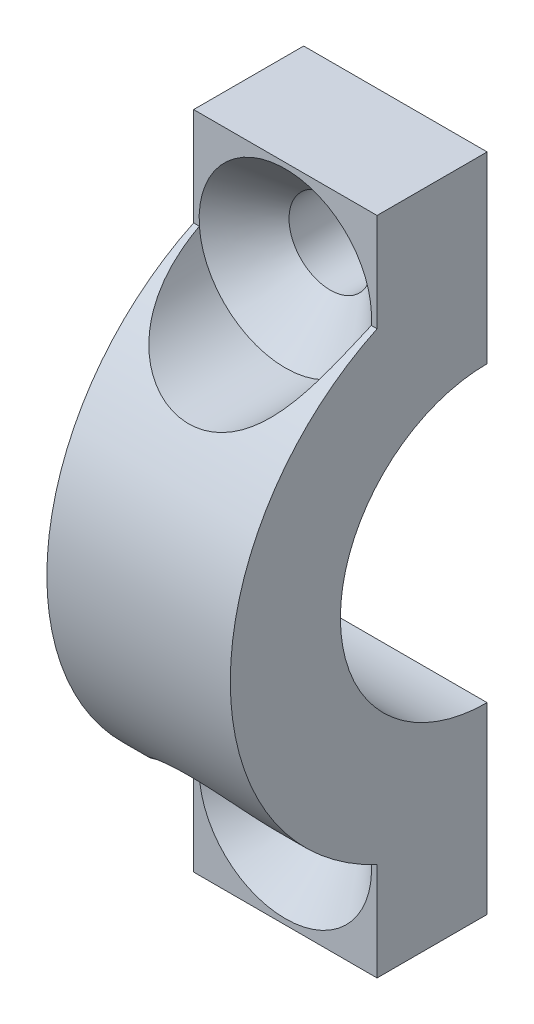
ISO-10303-21;
HEADER;
FILE_DESCRIPTION(('STEP AP214'),'2;1');
FILE_NAME('part.step','',(''),(''),'','','');
FILE_SCHEMA(('AUTOMOTIVE_DESIGN { 1 0 10303 214 1 1 1 1 }'));
ENDSEC;
DATA;
#1=APPLICATION_CONTEXT('core data for automotive mechanical design processes');
#2=APPLICATION_PROTOCOL_DEFINITION('international standard','automotive_design',2000,#1);
#3=PRODUCT_CONTEXT('',#1,'mechanical');
#4=PRODUCT('Part','Part','',(#3));
#5=PRODUCT_RELATED_PRODUCT_CATEGORY('part','',(#4));
#6=PRODUCT_DEFINITION_FORMATION('','',#4);
#7=PRODUCT_DEFINITION_CONTEXT('part definition',#1,'design');
#8=PRODUCT_DEFINITION('design','',#6,#7);
#9=PRODUCT_DEFINITION_SHAPE('','',#8);
#10=(LENGTH_UNIT() NAMED_UNIT(*) SI_UNIT(.MILLI.,.METRE.));
#11=(NAMED_UNIT(*) PLANE_ANGLE_UNIT() SI_UNIT($,.RADIAN.));
#12=(NAMED_UNIT(*) SI_UNIT($,.STERADIAN.) SOLID_ANGLE_UNIT());
#13=UNCERTAINTY_MEASURE_WITH_UNIT(LENGTH_MEASURE(1.E-05),#10,'distance_accuracy_value','');
#14=(GEOMETRIC_REPRESENTATION_CONTEXT(3) GLOBAL_UNCERTAINTY_ASSIGNED_CONTEXT((#13)) GLOBAL_UNIT_ASSIGNED_CONTEXT((#10,
#11,#12)) REPRESENTATION_CONTEXT('',''));
#15=CARTESIAN_POINT('',(0.,0.,0.));
#16=DIRECTION('',(0.,0.,1.));
#17=DIRECTION('',(1.,0.,0.));
#18=AXIS2_PLACEMENT_3D('',#15,#16,#17);
#19=CARTESIAN_POINT('',(15.,72.,18.));
#20=DIRECTION('',(-1.,0.,0.));
#21=DIRECTION('',(0.,0.,1.));
#22=AXIS2_PLACEMENT_3D('',#19,#20,#21);
#23=CYLINDRICAL_SURFACE('',#22,14.);
#24=CARTESIAN_POINT('',(14.6868834695895,84.6491106406736,23.9999999999999));
#25=CARTESIAN_POINT('',(14.6823539005448,84.5886792170102,24.1274015593818));
#26=CARTESIAN_POINT('',(14.6765172939017,84.5263433670282,24.2538435760604));
#27=CARTESIAN_POINT('',(14.661729002425,84.3979447212664,24.5046776273374));
#28=CARTESIAN_POINT('',(14.652776464601,84.3318809091053,24.6290690908181));
#29=CARTESIAN_POINT('',(14.6204102459824,84.1277205338109,24.9998682997629));
#30=CARTESIAN_POINT('',(14.5915165208751,83.9841474572963,25.2428631080751));
#31=CARTESIAN_POINT('',(14.5141507266147,83.6820083526137,25.7208624991565));
#32=CARTESIAN_POINT('',(14.4654186962824,83.52326554239,25.9557142157521));
#33=CARTESIAN_POINT('',(14.3432423004083,83.1953488194853,26.4108542290577));
#34=CARTESIAN_POINT('',(14.2698493195431,83.026197188877,26.6311716773669));
#35=CARTESIAN_POINT('',(14.1352341599305,82.7639172614953,26.9531292789493));
#36=CARTESIAN_POINT('',(14.0849195081585,82.6730333481254,27.0612277914284));
#37=CARTESIAN_POINT('',(13.9753243715645,82.490390528231,27.2720613250417));
#38=CARTESIAN_POINT('',(13.9160436213424,82.398631595881,27.3747961872886));
#39=CARTESIAN_POINT('',(13.7880992759076,82.2156296041822,27.5738775230491));
#40=CARTESIAN_POINT('',(13.7194723520586,82.1243859125023,27.6702468804612));
#41=CARTESIAN_POINT('',(13.5721245740286,81.9432777628691,27.856372760744));
#42=CARTESIAN_POINT('',(13.4934038710877,81.853413284273,27.9461293826651));
#43=CARTESIAN_POINT('',(13.3244125180841,81.6753131072687,28.1194841919881));
#44=CARTESIAN_POINT('',(13.2340045102641,81.5871139841926,28.2029866926637));
#45=CARTESIAN_POINT('',(13.042363918755,81.4152293115991,28.361812097394));
#46=CARTESIAN_POINT('',(12.9411334949725,81.3315428664514,28.4371366275587));
#47=CARTESIAN_POINT('',(12.7280303213367,81.1704186151429,28.5789862626215));
#48=CARTESIAN_POINT('',(12.6161563334604,81.0929815378281,28.6455103417247));
#49=CARTESIAN_POINT('',(12.3823626498263,80.9461888583714,28.7691652669169));
#50=CARTESIAN_POINT('',(12.2604452216227,80.8768314405376,28.8262982246053));
#51=CARTESIAN_POINT('',(12.0260110698942,80.7573620276484,28.9230779758885));
#52=CARTESIAN_POINT('',(11.9147210392595,80.7059186391237,28.9640599156844));
#53=CARTESIAN_POINT('',(11.6863371380591,80.6112028055511,29.0386059428302));
#54=CARTESIAN_POINT('',(11.5692442990841,80.5679289147076,29.0721713429007));
#55=CARTESIAN_POINT('',(11.3303063416184,80.4904489681364,29.1316964283244));
#56=CARTESIAN_POINT('',(11.2084642633792,80.4562372171402,29.1576608917106));
#57=CARTESIAN_POINT('',(10.9610937145978,80.3975603916059,29.2018897783838));
#58=CARTESIAN_POINT('',(10.8355657010723,80.3730941141665,29.2201551519995));
#59=CARTESIAN_POINT('',(10.5996820754628,80.3371061993207,29.2469144913718));
#60=CARTESIAN_POINT('',(10.4896396149932,80.3242589717311,29.2564130120863));
#61=CARTESIAN_POINT('',(10.2685802436299,80.3063705773454,29.2696199454961));
#62=CARTESIAN_POINT('',(10.1575634168155,80.301328743544,29.2733288529397));
#63=CARTESIAN_POINT('',(9.93545340716804,80.2991314873372,29.2749464718671));
#64=CARTESIAN_POINT('',(9.8243602695446,80.3019730608091,29.2728573927842));
#65=CARTESIAN_POINT('',(9.60291205565764,80.3154908742178,29.2628895965998));
#66=CARTESIAN_POINT('',(9.49255697957448,80.3261671160691,29.2550108780836));
#67=CARTESIAN_POINT('',(9.2778382619672,80.3546005272574,29.2339195444487));
#68=CARTESIAN_POINT('',(9.17341207330098,80.3720558719215,29.2209340227804));
#69=CARTESIAN_POINT('',(8.96669893434886,80.4137804146887,29.1896817688636));
#70=CARTESIAN_POINT('',(8.86441269370686,80.4380518358098,29.1714133135634));
#71=CARTESIAN_POINT('',(8.66273041101343,80.4930464237721,29.1296609145117));
#72=CARTESIAN_POINT('',(8.56333315997075,80.5237668462406,29.1061791890233));
#73=CARTESIAN_POINT('',(8.36796008250096,80.5912436298838,29.0540648620609));
#74=CARTESIAN_POINT('',(8.27198555096368,80.6280022465654,29.0254303354267));
#75=CARTESIAN_POINT('',(8.08178401922044,80.7079912105161,28.9623692841561));
#76=CARTESIAN_POINT('',(7.98765369636385,80.7513553020197,28.9278206244581));
#77=CARTESIAN_POINT('',(7.80405759359493,80.8432710509733,28.8535733507942));
#78=CARTESIAN_POINT('',(7.71459350994676,80.8918245755892,28.8138728820922));
#79=CARTESIAN_POINT('',(7.45385775328449,81.0442947980985,28.6872882556059));
#80=CARTESIAN_POINT('',(7.29012108935183,81.155073344968,28.5928805935764));
#81=CARTESIAN_POINT('',(6.97131429987674,81.3998484040593,28.376503455337));
#82=CARTESIAN_POINT('',(6.81834793116282,81.5350370116572,28.2528188108821));
#83=CARTESIAN_POINT('',(6.53924095630963,81.8137695156495,27.9863433746235));
#84=CARTESIAN_POINT('',(6.41309970388549,81.9573132106427,27.8435530432591));
#85=CARTESIAN_POINT('',(6.21306711267954,82.2127249239649,27.5773620783008));
#86=CARTESIAN_POINT('',(6.13387251047209,82.3240629772442,27.4573524476103));
#87=CARTESIAN_POINT('',(5.9891510858168,82.5462934932211,27.2088796515745));
#88=CARTESIAN_POINT('',(5.92363058605982,82.6571857266397,27.0804126116099));
#89=CARTESIAN_POINT('',(5.80476123159012,82.8773357422786,26.8155194942524));
#90=CARTESIAN_POINT('',(5.75147225359986,82.9865831361432,26.6790582031898));
#91=CARTESIAN_POINT('',(5.65606733654586,83.2016424595153,26.399660862454));
#92=CARTESIAN_POINT('',(5.61395415960595,83.3074535340684,26.2567232223374));
#93=CARTESIAN_POINT('',(5.53457530625007,83.528421768105,25.9458494753461));
#94=CARTESIAN_POINT('',(5.4986978608515,83.6429519353129,25.7771158396482));
#95=CARTESIAN_POINT('',(5.43755828991146,83.8653523691441,25.4333946302858));
#96=CARTESIAN_POINT('',(5.41230046014622,83.97321992563,25.2584045568052));
#97=CARTESIAN_POINT('',(5.3708513662753,84.1802397936259,24.9052951950059));
#98=CARTESIAN_POINT('',(5.35455092491359,84.2794840427283,24.7272421789051));
#99=CARTESIAN_POINT('',(5.32897419165093,84.4701976287886,24.366773895951));
#100=CARTESIAN_POINT('',(5.31969005694165,84.5616755450577,24.1843637355848));
#101=CARTESIAN_POINT('',(5.31311653041046,84.6491106406735,24.));
#102=B_SPLINE_CURVE_WITH_KNOTS('',3,(#24,#25,#26,#27,#28,#29,#30,#31,#32,#33,#34,#35,#36,#37,
#38,#39,#40,#41,#42,#43,#44,#45,#46,#47,#48,#49,#50,#51,#52,#53,#54,#55,#56,#57,#58,#59,#60,#61,
#62,#63,#64,#65,#66,#67,#68,#69,#70,#71,#72,#73,#74,#75,#76,#77,#78,#79,#80,#81,#82,#83,#84,#85,
#86,#87,#88,#89,#90,#91,#92,#93,#94,#95,#96,#97,#98,#99,#100,#101),.UNSPECIFIED.,.F.,.F.,(4,2,2,
2,2,2,2,2,2,2,2,2,2,2,2,2,2,2,2,2,2,2,2,2,2,2,2,2,2,2,2,2,2,2,2,2,2,2,4),(0.,0.423195212600214,
0.8465063667184,1.69656664790296,2.5581443222514,3.4179377931578,3.86740222850983,
4.31687997078842,4.76464236023668,5.21239804141275,5.66599869222872,6.11950898313544,
6.5730720894482,7.02653307189912,7.41378176108311,7.80096185261463,8.18789803323816,
8.57478643881981,8.90796041087282,9.24110591017275,9.57412447547004,9.90714312214675,
10.2267778523521,10.546516950611,10.8661202587244,11.1858432240683,11.5132120962637,
11.8406991553313,12.4952631566787,13.2086950237119,13.9221097004195,14.4669488469189,
15.012039363071,15.5597438963729,16.1075836702499,16.7282374289768,17.3491420094452,
17.962300612815,18.5747728112748),.UNSPECIFIED.);
#103=CARTESIAN_POINT('',(14.6868834695896,84.6491106406735,24.));
#104=VERTEX_POINT('',#103);
#105=CARTESIAN_POINT('',(5.31311653041048,84.6491106406736,23.9999999999999));
#106=VERTEX_POINT('',#105);
#107=EDGE_CURVE('E47',#104,#106,#102,.T.);
#108=ORIENTED_EDGE('',*,*,#107,.T.);
#109=DIRECTION('',(-1.,0.,0.));
#110=VECTOR('',#109,1.);
#111=CARTESIAN_POINT('',(15.,84.6491106406735,24.));
#112=LINE('',#111,#110);
#113=CARTESIAN_POINT('',(5.,84.6491106406735,24.));
#114=VERTEX_POINT('',#113);
#115=EDGE_CURVE('E119',#106,#114,#112,.T.);
#116=ORIENTED_EDGE('',*,*,#115,.T.);
#117=CARTESIAN_POINT('',(5.,72.,18.));
#118=DIRECTION('',(1.,0.,0.));
#119=DIRECTION('',(0.,0.,-1.));
#120=AXIS2_PLACEMENT_3D('',#117,#118,#119);
#121=CIRCLE('',#120,14.);
#122=CARTESIAN_POINT('',(5.,59.3508893593265,24.));
#123=VERTEX_POINT('',#122);
#124=EDGE_CURVE('E170',#114,#123,#121,.T.);
#125=ORIENTED_EDGE('',*,*,#124,.T.);
#126=DIRECTION('',(-1.,0.,0.));
#127=VECTOR('',#126,1.);
#128=CARTESIAN_POINT('',(15.,59.3508893593265,24.));
#129=LINE('',#128,#127);
#130=CARTESIAN_POINT('',(5.31311653041043,59.3508893593265,24.));
#131=VERTEX_POINT('',#130);
#132=EDGE_CURVE('E41',#131,#123,#129,.T.);
#133=ORIENTED_EDGE('',*,*,#132,.F.);
#134=CARTESIAN_POINT('',(5.31311653041046,59.3508893593264,23.9999999999999));
#135=CARTESIAN_POINT('',(5.31764609945523,59.4113207829898,24.1274015593818));
#136=CARTESIAN_POINT('',(5.32348270609832,59.4736566329718,24.2538435760604));
#137=CARTESIAN_POINT('',(5.33827099757497,59.6020552787336,24.5046776273374));
#138=CARTESIAN_POINT('',(5.34722353539904,59.6681190908947,24.6290690908181));
#139=CARTESIAN_POINT('',(5.37958975401756,59.8722794661892,24.9998682997629));
#140=CARTESIAN_POINT('',(5.40848347912487,60.0158525427037,25.2428631080751));
#141=CARTESIAN_POINT('',(5.48584927338526,60.3179916473863,25.7208624991565));
#142=CARTESIAN_POINT('',(5.5345813037176,60.47673445761,25.9557142157521));
#143=CARTESIAN_POINT('',(5.65675769959167,60.8046511805147,26.4108542290577));
#144=CARTESIAN_POINT('',(5.73015068045693,60.973802811123,26.6311716773669));
#145=CARTESIAN_POINT('',(5.86476584006947,61.2360827385047,26.9531292789493));
#146=CARTESIAN_POINT('',(5.91508049184144,61.3269666518746,27.0612277914284));
#147=CARTESIAN_POINT('',(6.0246756284355,61.509609471769,27.2720613250417));
#148=CARTESIAN_POINT('',(6.08395637865759,61.601368404119,27.3747961872886));
#149=CARTESIAN_POINT('',(6.21190072409242,61.7843703958178,27.5738775230491));
#150=CARTESIAN_POINT('',(6.28052764794135,61.8756140874977,27.6702468804612));
#151=CARTESIAN_POINT('',(6.42787542597143,62.0567222371309,27.856372760744));
#152=CARTESIAN_POINT('',(6.50659612891225,62.146586715727,27.9461293826651));
#153=CARTESIAN_POINT('',(6.67558748191585,62.3246868927313,28.1194841919881));
#154=CARTESIAN_POINT('',(6.76599548973591,62.4128860158074,28.2029866926637));
#155=CARTESIAN_POINT('',(6.95763608124504,62.5847706884009,28.361812097394));
#156=CARTESIAN_POINT('',(7.05886650502746,62.6684571335487,28.4371366275587));
#157=CARTESIAN_POINT('',(7.27196967866328,62.8295813848571,28.5789862626215));
#158=CARTESIAN_POINT('',(7.38384366653956,62.9070184621719,28.6455103417247));
#159=CARTESIAN_POINT('',(7.61763735017365,63.0538111416286,28.7691652669169));
#160=CARTESIAN_POINT('',(7.73955477837726,63.1231685594624,28.8262982246053));
#161=CARTESIAN_POINT('',(7.97398893010577,63.2426379723516,28.9230779758885));
#162=CARTESIAN_POINT('',(8.08527896074048,63.2940813608763,28.9640599156844));
#163=CARTESIAN_POINT('',(8.31366286194089,63.3887971944489,29.0386059428303));
#164=CARTESIAN_POINT('',(8.43075570091592,63.4320710852924,29.0721713429007));
#165=CARTESIAN_POINT('',(8.66969365838158,63.5095510318636,29.1316964283244));
#166=CARTESIAN_POINT('',(8.79153573662078,63.5437627828598,29.1576608917106));
#167=CARTESIAN_POINT('',(9.03890628540216,63.6024396083941,29.2018897783838));
#168=CARTESIAN_POINT('',(9.16443429892773,63.6269058858336,29.2201551519995));
#169=CARTESIAN_POINT('',(9.40031792453716,63.6628938006793,29.2469144913718));
#170=CARTESIAN_POINT('',(9.51036038500679,63.6757410282689,29.2564130120863));
#171=CARTESIAN_POINT('',(9.73141975637014,63.6936294226546,29.2696199454961));
#172=CARTESIAN_POINT('',(9.84243658318452,63.698671256456,29.2733288529397));
#173=CARTESIAN_POINT('',(10.064546592832,63.7008685126628,29.2749464718671));
#174=CARTESIAN_POINT('',(10.1756397304554,63.6980269391909,29.2728573927842));
#175=CARTESIAN_POINT('',(10.3970879443424,63.6845091257822,29.2628895965998));
#176=CARTESIAN_POINT('',(10.5074430204255,63.6738328839309,29.2550108780836));
#177=CARTESIAN_POINT('',(10.7221617380328,63.6453994727426,29.2339195444487));
#178=CARTESIAN_POINT('',(10.826587926699,63.6279441280785,29.2209340227804));
#179=CARTESIAN_POINT('',(11.0333010656511,63.5862195853113,29.1896817688636));
#180=CARTESIAN_POINT('',(11.1355873062931,63.5619481641902,29.1714133135634));
#181=CARTESIAN_POINT('',(11.3372695889866,63.506953576228,29.1296609145117));
#182=CARTESIAN_POINT('',(11.4366668400293,63.4762331537594,29.1061791890233));
#183=CARTESIAN_POINT('',(11.632039917499,63.4087563701162,29.0540648620609));
#184=CARTESIAN_POINT('',(11.7280144490363,63.3719977534346,29.0254303354267));
#185=CARTESIAN_POINT('',(11.9182159807796,63.2920087894839,28.9623692841561));
#186=CARTESIAN_POINT('',(12.0123463036362,63.2486446979803,28.9278206244581));
#187=CARTESIAN_POINT('',(12.1959424064051,63.1567289490267,28.8535733507942));
#188=CARTESIAN_POINT('',(12.2854064900532,63.1081754244108,28.8138728820922));
#189=CARTESIAN_POINT('',(12.5461422467155,62.9557052019015,28.6872882556059));
#190=CARTESIAN_POINT('',(12.7098789106482,62.844926655032,28.5928805935764));
#191=CARTESIAN_POINT('',(13.0286857001233,62.6001515959407,28.376503455337));
#192=CARTESIAN_POINT('',(13.1816520688372,62.4649629883428,28.2528188108821));
#193=CARTESIAN_POINT('',(13.4607590436904,62.1862304843505,27.9863433746235));
#194=CARTESIAN_POINT('',(13.5869002961145,62.0426867893573,27.8435530432591));
#195=CARTESIAN_POINT('',(13.7869328873205,61.7872750760351,27.5773620783008));
#196=CARTESIAN_POINT('',(13.8661274895279,61.6759370227558,27.4573524476103));
#197=CARTESIAN_POINT('',(14.0108489141832,61.4537065067789,27.2088796515745));
#198=CARTESIAN_POINT('',(14.0763694139402,61.3428142733603,27.0804126116099));
#199=CARTESIAN_POINT('',(14.1952387684099,61.1226642577215,26.8155194942524));
#200=CARTESIAN_POINT('',(14.2485277464001,61.0134168638568,26.6790582031898));
#201=CARTESIAN_POINT('',(14.3439326634541,60.7983575404848,26.399660862454));
#202=CARTESIAN_POINT('',(14.386045840394,60.6925464659317,26.2567232223373));
#203=CARTESIAN_POINT('',(14.4654246937499,60.471578231895,25.9458494753461));
#204=CARTESIAN_POINT('',(14.5013021391485,60.3570480646871,25.7771158396482));
#205=CARTESIAN_POINT('',(14.5624417100885,60.1346476308559,25.4333946302858));
#206=CARTESIAN_POINT('',(14.5876995398538,60.02678007437,25.2584045568052));
#207=CARTESIAN_POINT('',(14.6291486337247,59.8197602063741,24.9052951950059));
#208=CARTESIAN_POINT('',(14.6454490750864,59.7205159572717,24.7272421789051));
#209=CARTESIAN_POINT('',(14.6710258083491,59.5298023712114,24.366773895951));
#210=CARTESIAN_POINT('',(14.6803099430583,59.4383244549423,24.1843637355848));
#211=CARTESIAN_POINT('',(14.6868834695895,59.3508893593265,24.));
#212=B_SPLINE_CURVE_WITH_KNOTS('',3,(#134,#135,#136,#137,#138,#139,#140,#141,#142,#143,#144,
#145,#146,#147,#148,#149,#150,#151,#152,#153,#154,#155,#156,#157,#158,#159,#160,#161,#162,#163,
#164,#165,#166,#167,#168,#169,#170,#171,#172,#173,#174,#175,#176,#177,#178,#179,#180,#181,#182,
#183,#184,#185,#186,#187,#188,#189,#190,#191,#192,#193,#194,#195,#196,#197,#198,#199,#200,#201,
#202,#203,#204,#205,#206,#207,#208,#209,#210,#211),.UNSPECIFIED.,.F.,.F.,(4,2,2,2,2,2,2,2,2,2,2,
2,2,2,2,2,2,2,2,2,2,2,2,2,2,2,2,2,2,2,2,2,2,2,2,2,2,2,4),(0.,0.423195212600214,0.8465063667184,
1.69656664790294,2.55814432225137,3.41793779315778,3.86740222850982,4.31687997078841,
4.76464236023667,5.21239804141274,5.66599869222872,6.11950898313544,6.57307208944819,
7.02653307189912,7.41378176108312,7.80096185261464,8.18789803323816,8.57478643881981,
8.90796041087283,9.24110591017276,9.57412447547005,9.90714312214676,10.2267778523521,
10.546516950611,10.8661202587244,11.1858432240683,11.5132120962637,11.8406991553313,
12.4952631566787,13.2086950237119,13.9221097004195,14.4669488469189,15.012039363071,
15.5597438963729,16.1075836702499,16.7282374289769,17.3491420094452,17.962300612815,
18.5747728112748),.UNSPECIFIED.);
#213=CARTESIAN_POINT('',(14.6868834695895,59.3508893593265,23.9999999999999));
#214=VERTEX_POINT('',#213);
#215=EDGE_CURVE('E54',#131,#214,#212,.T.);
#216=ORIENTED_EDGE('',*,*,#215,.T.);
#217=CARTESIAN_POINT('',(15.,59.3508893593265,24.));
#218=VERTEX_POINT('',#217);
#219=EDGE_CURVE('E11',#218,#214,#129,.T.);
#220=ORIENTED_EDGE('',*,*,#219,.F.);
#221=CARTESIAN_POINT('',(15.,72.,18.));
#222=DIRECTION('',(1.,0.,0.));
#223=DIRECTION('',(0.,0.,-1.));
#224=AXIS2_PLACEMENT_3D('',#221,#222,#223);
#225=CIRCLE('',#224,14.);
#226=CARTESIAN_POINT('',(15.,84.6491106406735,24.));
#227=VERTEX_POINT('',#226);
#228=EDGE_CURVE('E189',#227,#218,#225,.T.);
#229=ORIENTED_EDGE('',*,*,#228,.F.);
#230=EDGE_CURVE('E123',#227,#104,#112,.T.);
#231=ORIENTED_EDGE('',*,*,#230,.T.);
#232=EDGE_LOOP('',(#108,#116,#125,#133,#216,#220,#229,#231));
#233=FACE_BOUND('',#232,.T.);
#234=ADVANCED_FACE('F34',(#233),#23,.T.);
#235=CARTESIAN_POINT('',(15.,90.,24.));
#236=DIRECTION('',(0.,0.,-1.));
#237=DIRECTION('',(0.,1.,0.));
#238=AXIS2_PLACEMENT_3D('',#235,#236,#237);
#239=PLANE('',#238);
#240=CARTESIAN_POINT('',(10.,85.,23.9999999999999));
#241=DIRECTION('',(0.,0.,1.));
#242=DIRECTION('',(0.,-1.,0.));
#243=AXIS2_PLACEMENT_3D('',#240,#241,#242);
#244=CIRCLE('',#243,4.7);
#245=EDGE_CURVE('E112',#104,#106,#244,.T.);
#246=ORIENTED_EDGE('',*,*,#245,.F.);
#247=ORIENTED_EDGE('',*,*,#230,.F.);
#248=DIRECTION('',(0.,-1.,0.));
#249=VECTOR('',#248,1.);
#250=CARTESIAN_POINT('',(15.,90.,24.));
#251=LINE('',#250,#249);
#252=CARTESIAN_POINT('',(15.,90.,24.));
#253=VERTEX_POINT('',#252);
#254=EDGE_CURVE('E134',#253,#227,#251,.T.);
#255=ORIENTED_EDGE('',*,*,#254,.F.);
#256=DIRECTION('',(-1.,0.,0.));
#257=VECTOR('',#256,1.);
#258=CARTESIAN_POINT('',(15.,90.,24.));
#259=LINE('',#258,#257);
#260=CARTESIAN_POINT('',(5.,90.,24.));
#261=VERTEX_POINT('',#260);
#262=EDGE_CURVE('E136',#253,#261,#259,.T.);
#263=ORIENTED_EDGE('',*,*,#262,.T.);
#264=DIRECTION('',(0.,-1.,0.));
#265=VECTOR('',#264,1.);
#266=CARTESIAN_POINT('',(5.,90.,24.));
#267=LINE('',#266,#265);
#268=EDGE_CURVE('E132',#261,#114,#267,.T.);
#269=ORIENTED_EDGE('',*,*,#268,.T.);
#270=ORIENTED_EDGE('',*,*,#115,.F.);
#271=EDGE_LOOP('',(#246,#247,#255,#263,#269,#270));
#272=FACE_BOUND('',#271,.T.);
#273=ADVANCED_FACE('F129',(#272),#239,.F.);
#274=CARTESIAN_POINT('',(15.,54.,24.));
#275=DIRECTION('',(0.,0.,-1.));
#276=DIRECTION('',(-1.,0.,0.));
#277=AXIS2_PLACEMENT_3D('',#274,#275,#276);
#278=PLANE('',#277);
#279=ORIENTED_EDGE('',*,*,#219,.T.);
#280=CARTESIAN_POINT('',(10.,59.,23.9999999999999));
#281=DIRECTION('',(0.,0.,1.));
#282=DIRECTION('',(0.,-1.,0.));
#283=AXIS2_PLACEMENT_3D('',#280,#281,#282);
#284=CIRCLE('',#283,4.7);
#285=EDGE_CURVE('E167',#131,#214,#284,.T.);
#286=ORIENTED_EDGE('',*,*,#285,.F.);
#287=ORIENTED_EDGE('',*,*,#132,.T.);
#288=DIRECTION('',(0.,-1.,0.));
#289=VECTOR('',#288,1.);
#290=CARTESIAN_POINT('',(5.,54.,24.));
#291=LINE('',#290,#289);
#292=CARTESIAN_POINT('',(5.,54.,24.));
#293=VERTEX_POINT('',#292);
#294=EDGE_CURVE('E165',#123,#293,#291,.T.);
#295=ORIENTED_EDGE('',*,*,#294,.T.);
#296=DIRECTION('',(-1.,0.,0.));
#297=VECTOR('',#296,1.);
#298=CARTESIAN_POINT('',(15.,54.,24.));
#299=LINE('',#298,#297);
#300=CARTESIAN_POINT('',(15.,54.,24.));
#301=VERTEX_POINT('',#300);
#302=EDGE_CURVE('E154',#301,#293,#299,.T.);
#303=ORIENTED_EDGE('',*,*,#302,.F.);
#304=DIRECTION('',(0.,-1.,0.));
#305=VECTOR('',#304,1.);
#306=CARTESIAN_POINT('',(15.,54.,24.));
#307=LINE('',#306,#305);
#308=EDGE_CURVE('E191',#218,#301,#307,.T.);
#309=ORIENTED_EDGE('',*,*,#308,.F.);
#310=EDGE_LOOP('',(#279,#286,#287,#295,#303,#309));
#311=FACE_BOUND('',#310,.T.);
#312=ADVANCED_FACE('F164',(#311),#278,.F.);
#313=CARTESIAN_POINT('',(15.,54.,18.));
#314=DIRECTION('',(0.,1.,0.));
#315=DIRECTION('',(0.,0.,1.));
#316=AXIS2_PLACEMENT_3D('',#313,#314,#315);
#317=PLANE('',#316);
#318=DIRECTION('',(0.,0.,-1.));
#319=VECTOR('',#318,1.);
#320=CARTESIAN_POINT('',(5.,54.,18.));
#321=LINE('',#320,#319);
#322=CARTESIAN_POINT('',(5.,54.,18.));
#323=VERTEX_POINT('',#322);
#324=EDGE_CURVE('E172',#293,#323,#321,.T.);
#325=ORIENTED_EDGE('',*,*,#324,.T.);
#326=DIRECTION('',(-1.,0.,0.));
#327=VECTOR('',#326,1.);
#328=CARTESIAN_POINT('',(15.,54.,18.));
#329=LINE('',#328,#327);
#330=CARTESIAN_POINT('',(15.,54.,18.));
#331=VERTEX_POINT('',#330);
#332=EDGE_CURVE('E152',#331,#323,#329,.T.);
#333=ORIENTED_EDGE('',*,*,#332,.F.);
#334=DIRECTION('',(0.,0.,-1.));
#335=VECTOR('',#334,1.);
#336=CARTESIAN_POINT('',(15.,54.,18.));
#337=LINE('',#336,#335);
#338=EDGE_CURVE('E195',#301,#331,#337,.T.);
#339=ORIENTED_EDGE('',*,*,#338,.F.);
#340=ORIENTED_EDGE('',*,*,#302,.T.);
#341=EDGE_LOOP('',(#325,#333,#339,#340));
#342=FACE_BOUND('',#341,.T.);
#343=ADVANCED_FACE('F214',(#342),#317,.F.);
#344=CARTESIAN_POINT('',(15.,64.,18.));
#345=DIRECTION('',(0.,0.,1.));
#346=DIRECTION('',(0.,-1.,0.));
#347=AXIS2_PLACEMENT_3D('',#344,#345,#346);
#348=PLANE('',#347);
#349=CARTESIAN_POINT('',(10.,59.,18.));
#350=DIRECTION('',(0.,0.,1.));
#351=DIRECTION('',(0.,-1.,0.));
#352=AXIS2_PLACEMENT_3D('',#349,#350,#351);
#353=CIRCLE('',#352,2.25);
#354=CARTESIAN_POINT('',(10.,56.75,18.));
#355=VERTEX_POINT('',#354);
#356=EDGE_CURVE('E128',#355,#355,#353,.T.);
#357=ORIENTED_EDGE('',*,*,#356,.T.);
#358=EDGE_LOOP('',(#357));
#359=FACE_BOUND('',#358,.T.);
#360=DIRECTION('',(0.,1.,0.));
#361=VECTOR('',#360,1.);
#362=CARTESIAN_POINT('',(5.,64.,18.));
#363=LINE('',#362,#361);
#364=CARTESIAN_POINT('',(5.,64.,18.));
#365=VERTEX_POINT('',#364);
#366=EDGE_CURVE('E180',#323,#365,#363,.T.);
#367=ORIENTED_EDGE('',*,*,#366,.T.);
#368=DIRECTION('',(-1.,0.,0.));
#369=VECTOR('',#368,1.);
#370=CARTESIAN_POINT('',(15.,64.,18.));
#371=LINE('',#370,#369);
#372=CARTESIAN_POINT('',(15.,64.,18.));
#373=VERTEX_POINT('',#372);
#374=EDGE_CURVE('E149',#373,#365,#371,.T.);
#375=ORIENTED_EDGE('',*,*,#374,.F.);
#376=DIRECTION('',(0.,1.,0.));
#377=VECTOR('',#376,1.);
#378=CARTESIAN_POINT('',(15.,64.,18.));
#379=LINE('',#378,#377);
#380=EDGE_CURVE('E200',#331,#373,#379,.T.);
#381=ORIENTED_EDGE('',*,*,#380,.F.);
#382=ORIENTED_EDGE('',*,*,#332,.T.);
#383=EDGE_LOOP('',(#367,#375,#381,#382));
#384=FACE_BOUND('',#383,.T.);
#385=ADVANCED_FACE('F216',(#359,#384),#348,.F.);
#386=CARTESIAN_POINT('',(15.,72.,18.));
#387=DIRECTION('',(-1.,0.,0.));
#388=DIRECTION('',(0.,0.,1.));
#389=AXIS2_PLACEMENT_3D('',#386,#387,#388);
#390=CYLINDRICAL_SURFACE('',#389,8.00000000000001);
#391=CARTESIAN_POINT('',(5.,72.,18.));
#392=DIRECTION('',(-1.,0.,0.));
#393=DIRECTION('',(0.,0.,-1.));
#394=AXIS2_PLACEMENT_3D('',#391,#392,#393);
#395=CIRCLE('',#394,8.00000000000001);
#396=CARTESIAN_POINT('',(5.,80.,18.));
#397=VERTEX_POINT('',#396);
#398=EDGE_CURVE('E182',#365,#397,#395,.T.);
#399=ORIENTED_EDGE('',*,*,#398,.T.);
#400=DIRECTION('',(-1.,0.,0.));
#401=VECTOR('',#400,1.);
#402=CARTESIAN_POINT('',(15.,80.,18.));
#403=LINE('',#402,#401);
#404=CARTESIAN_POINT('',(15.,80.,18.));
#405=VERTEX_POINT('',#404);
#406=EDGE_CURVE('E146',#405,#397,#403,.T.);
#407=ORIENTED_EDGE('',*,*,#406,.F.);
#408=CARTESIAN_POINT('',(15.,72.,18.));
#409=DIRECTION('',(-1.,0.,0.));
#410=DIRECTION('',(0.,0.,-1.));
#411=AXIS2_PLACEMENT_3D('',#408,#409,#410);
#412=CIRCLE('',#411,8.00000000000001);
#413=EDGE_CURVE('E202',#373,#405,#412,.T.);
#414=ORIENTED_EDGE('',*,*,#413,.F.);
#415=ORIENTED_EDGE('',*,*,#374,.T.);
#416=EDGE_LOOP('',(#399,#407,#414,#415));
#417=FACE_BOUND('',#416,.T.);
#418=ADVANCED_FACE('F221',(#417),#390,.F.);
#419=CARTESIAN_POINT('',(15.,80.,18.));
#420=DIRECTION('',(0.,0.,1.));
#421=DIRECTION('',(1.,0.,0.));
#422=AXIS2_PLACEMENT_3D('',#419,#420,#421);
#423=PLANE('',#422);
#424=CARTESIAN_POINT('',(10.,85.,18.));
#425=DIRECTION('',(0.,0.,1.));
#426=DIRECTION('',(0.,-1.,0.));
#427=AXIS2_PLACEMENT_3D('',#424,#425,#426);
#428=CIRCLE('',#427,2.25);
#429=CARTESIAN_POINT('',(10.,82.75,18.));
#430=VERTEX_POINT('',#429);
#431=EDGE_CURVE('E124',#430,#430,#428,.T.);
#432=ORIENTED_EDGE('',*,*,#431,.T.);
#433=EDGE_LOOP('',(#432));
#434=FACE_BOUND('',#433,.T.);
#435=DIRECTION('',(0.,1.,0.));
#436=VECTOR('',#435,1.);
#437=CARTESIAN_POINT('',(5.,80.,18.));
#438=LINE('',#437,#436);
#439=CARTESIAN_POINT('',(5.,90.,18.));
#440=VERTEX_POINT('',#439);
#441=EDGE_CURVE('E184',#397,#440,#438,.T.);
#442=ORIENTED_EDGE('',*,*,#441,.T.);
#443=DIRECTION('',(-1.,0.,0.));
#444=VECTOR('',#443,1.);
#445=CARTESIAN_POINT('',(15.,90.,18.));
#446=LINE('',#445,#444);
#447=CARTESIAN_POINT('',(15.,90.,18.));
#448=VERTEX_POINT('',#447);
#449=EDGE_CURVE('E143',#448,#440,#446,.T.);
#450=ORIENTED_EDGE('',*,*,#449,.F.);
#451=DIRECTION('',(0.,1.,0.));
#452=VECTOR('',#451,1.);
#453=CARTESIAN_POINT('',(15.,80.,18.));
#454=LINE('',#453,#452);
#455=EDGE_CURVE('E204',#405,#448,#454,.T.);
#456=ORIENTED_EDGE('',*,*,#455,.F.);
#457=ORIENTED_EDGE('',*,*,#406,.T.);
#458=EDGE_LOOP('',(#442,#450,#456,#457));
#459=FACE_BOUND('',#458,.T.);
#460=ADVANCED_FACE('F224',(#434,#459),#423,.F.);
#461=CARTESIAN_POINT('',(15.,90.,18.));
#462=DIRECTION('',(0.,-1.,0.));
#463=DIRECTION('',(0.,0.,-1.));
#464=AXIS2_PLACEMENT_3D('',#461,#462,#463);
#465=PLANE('',#464);
#466=DIRECTION('',(0.,0.,1.));
#467=VECTOR('',#466,1.);
#468=CARTESIAN_POINT('',(5.,90.,18.));
#469=LINE('',#468,#467);
#470=EDGE_CURVE('E185',#440,#261,#469,.T.);
#471=ORIENTED_EDGE('',*,*,#470,.T.);
#472=ORIENTED_EDGE('',*,*,#262,.F.);
#473=DIRECTION('',(0.,0.,1.));
#474=VECTOR('',#473,1.);
#475=CARTESIAN_POINT('',(15.,90.,18.));
#476=LINE('',#475,#474);
#477=EDGE_CURVE('E137',#448,#253,#476,.T.);
#478=ORIENTED_EDGE('',*,*,#477,.F.);
#479=ORIENTED_EDGE('',*,*,#449,.T.);
#480=EDGE_LOOP('',(#471,#472,#478,#479));
#481=FACE_BOUND('',#480,.T.);
#482=ADVANCED_FACE('F210',(#481),#465,.F.);
#483=CARTESIAN_POINT('',(15.,72.,18.));
#484=DIRECTION('',(1.,0.,0.));
#485=DIRECTION('',(0.,0.,-1.));
#486=AXIS2_PLACEMENT_3D('',#483,#484,#485);
#487=PLANE('',#486);
#488=ORIENTED_EDGE('',*,*,#228,.T.);
#489=ORIENTED_EDGE('',*,*,#308,.T.);
#490=ORIENTED_EDGE('',*,*,#338,.T.);
#491=ORIENTED_EDGE('',*,*,#380,.T.);
#492=ORIENTED_EDGE('',*,*,#413,.T.);
#493=ORIENTED_EDGE('',*,*,#455,.T.);
#494=ORIENTED_EDGE('',*,*,#477,.T.);
#495=ORIENTED_EDGE('',*,*,#254,.T.);
#496=EDGE_LOOP('',(#488,#489,#490,#491,#492,#493,#494,#495));
#497=FACE_BOUND('',#496,.T.);
#498=ADVANCED_FACE('F206',(#497),#487,.T.);
#499=CARTESIAN_POINT('',(5.,72.,18.));
#500=DIRECTION('',(1.,0.,0.));
#501=DIRECTION('',(0.,0.,-1.));
#502=AXIS2_PLACEMENT_3D('',#499,#500,#501);
#503=PLANE('',#502);
#504=ORIENTED_EDGE('',*,*,#124,.F.);
#505=ORIENTED_EDGE('',*,*,#268,.F.);
#506=ORIENTED_EDGE('',*,*,#470,.F.);
#507=ORIENTED_EDGE('',*,*,#441,.F.);
#508=ORIENTED_EDGE('',*,*,#398,.F.);
#509=ORIENTED_EDGE('',*,*,#366,.F.);
#510=ORIENTED_EDGE('',*,*,#324,.F.);
#511=ORIENTED_EDGE('',*,*,#294,.F.);
#512=EDGE_LOOP('',(#504,#505,#506,#507,#508,#509,#510,#511));
#513=FACE_BOUND('',#512,.T.);
#514=ADVANCED_FACE('F169',(#513),#503,.F.);
#515=CARTESIAN_POINT('',(10.,59.,23.9999999999999));
#516=DIRECTION('',(0.,0.,1.));
#517=DIRECTION('',(0.,-1.,0.));
#518=AXIS2_PLACEMENT_3D('',#515,#516,#517);
#519=CONICAL_SURFACE('',#518,4.7,0.785398163397448);
#520=CARTESIAN_POINT('',(10.,59.,21.5499999999999));
#521=DIRECTION('',(0.,0.,1.));
#522=DIRECTION('',(0.,-1.,0.));
#523=AXIS2_PLACEMENT_3D('',#520,#521,#522);
#524=CIRCLE('',#523,2.25);
#525=CARTESIAN_POINT('',(10.,56.75,21.5499999999999));
#526=VERTEX_POINT('',#525);
#527=EDGE_CURVE('E284',#526,#526,#524,.T.);
#528=ORIENTED_EDGE('',*,*,#527,.F.);
#529=EDGE_LOOP('',(#528));
#530=FACE_BOUND('',#529,.T.);
#531=EDGE_CURVE('E174',#214,#131,#284,.T.);
#532=ORIENTED_EDGE('',*,*,#531,.T.);
#533=ORIENTED_EDGE('',*,*,#285,.T.);
#534=EDGE_LOOP('',(#532,#533));
#535=FACE_BOUND('',#534,.T.);
#536=ADVANCED_FACE('F246',(#530,#535),#519,.F.);
#537=CARTESIAN_POINT('',(10.,59.,23.9999999999999));
#538=DIRECTION('',(0.,0.,1.));
#539=DIRECTION('',(0.,-1.,0.));
#540=AXIS2_PLACEMENT_3D('',#537,#538,#539);
#541=CYLINDRICAL_SURFACE('',#540,2.25);
#542=ORIENTED_EDGE('',*,*,#356,.F.);
#543=EDGE_LOOP('',(#542));
#544=FACE_BOUND('',#543,.T.);
#545=ORIENTED_EDGE('',*,*,#527,.T.);
#546=EDGE_LOOP('',(#545));
#547=FACE_BOUND('',#546,.T.);
#548=ADVANCED_FACE('F251',(#544,#547),#541,.F.);
#549=CARTESIAN_POINT('',(10.,85.,23.9999999999999));
#550=DIRECTION('',(0.,0.,1.));
#551=DIRECTION('',(0.,-1.,0.));
#552=AXIS2_PLACEMENT_3D('',#549,#550,#551);
#553=CONICAL_SURFACE('',#552,4.7,0.785398163397449);
#554=CARTESIAN_POINT('',(10.,85.,21.5499999999999));
#555=DIRECTION('',(0.,0.,1.));
#556=DIRECTION('',(0.,-1.,0.));
#557=AXIS2_PLACEMENT_3D('',#554,#555,#556);
#558=CIRCLE('',#557,2.25);
#559=CARTESIAN_POINT('',(10.,82.75,21.5499999999999));
#560=VERTEX_POINT('',#559);
#561=EDGE_CURVE('E113',#560,#560,#558,.T.);
#562=ORIENTED_EDGE('',*,*,#561,.F.);
#563=EDGE_LOOP('',(#562));
#564=FACE_BOUND('',#563,.T.);
#565=ORIENTED_EDGE('',*,*,#245,.T.);
#566=EDGE_CURVE('E107',#106,#104,#244,.T.);
#567=ORIENTED_EDGE('',*,*,#566,.T.);
#568=EDGE_LOOP('',(#565,#567));
#569=FACE_BOUND('',#568,.T.);
#570=ADVANCED_FACE('F126',(#564,#569),#553,.F.);
#571=CARTESIAN_POINT('',(10.,85.,23.9999999999999));
#572=DIRECTION('',(0.,0.,1.));
#573=DIRECTION('',(0.,-1.,0.));
#574=AXIS2_PLACEMENT_3D('',#571,#572,#573);
#575=CYLINDRICAL_SURFACE('',#574,2.25);
#576=ORIENTED_EDGE('',*,*,#431,.F.);
#577=EDGE_LOOP('',(#576));
#578=FACE_BOUND('',#577,.T.);
#579=ORIENTED_EDGE('',*,*,#561,.T.);
#580=EDGE_LOOP('',(#579));
#581=FACE_BOUND('',#580,.T.);
#582=ADVANCED_FACE('F258',(#578,#581),#575,.F.);
#583=CARTESIAN_POINT('',(10.,85.,38.3016892397852));
#584=DIRECTION('',(0.,0.,-1.));
#585=DIRECTION('',(-1.,0.,0.));
#586=AXIS2_PLACEMENT_3D('',#583,#584,#585);
#587=CYLINDRICAL_SURFACE('',#586,4.70000000000003);
#588=ORIENTED_EDGE('',*,*,#566,.F.);
#589=ORIENTED_EDGE('',*,*,#107,.F.);
#590=EDGE_LOOP('',(#588,#589));
#591=FACE_BOUND('',#590,.T.);
#592=ADVANCED_FACE('F108',(#591),#587,.F.);
#593=CARTESIAN_POINT('',(10.,59.,38.3016892397852));
#594=DIRECTION('',(0.,0.,-1.));
#595=DIRECTION('',(-1.,0.,0.));
#596=AXIS2_PLACEMENT_3D('',#593,#594,#595);
#597=CYLINDRICAL_SURFACE('',#596,4.70000000000003);
#598=ORIENTED_EDGE('',*,*,#531,.F.);
#599=ORIENTED_EDGE('',*,*,#215,.F.);
#600=EDGE_LOOP('',(#598,#599));
#601=FACE_BOUND('',#600,.T.);
#602=ADVANCED_FACE('F263',(#601),#597,.F.);
#603=CLOSED_SHELL('',(#234,#273,#312,#343,#385,#418,#460,#482,#498,#514,#536,#548,#570,#582,
#592,#602));
#604=MANIFOLD_SOLID_BREP('B2',#603);
#605=ADVANCED_BREP_SHAPE_REPRESENTATION('',(#18,#604),#14);
#606=SHAPE_DEFINITION_REPRESENTATION(#9,#605);
ENDSEC;
END-ISO-10303-21;
